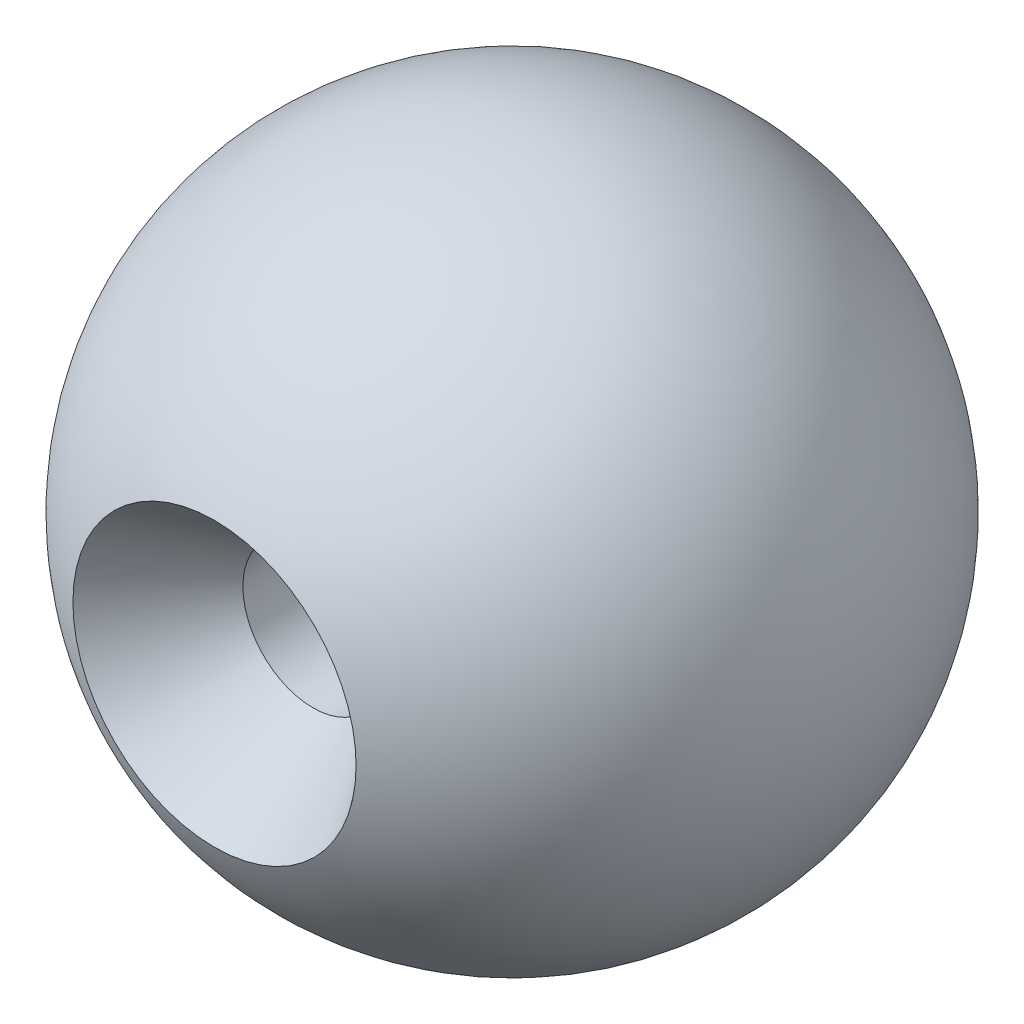
ISO-10303-21;
HEADER;
FILE_DESCRIPTION(('STEP AP214'),'2;1');
FILE_NAME('part.step','',(''),(''),'','','');
FILE_SCHEMA(('AUTOMOTIVE_DESIGN { 1 0 10303 214 1 1 1 1 }'));
ENDSEC;
DATA;
#1=APPLICATION_CONTEXT('core data for automotive mechanical design processes');
#2=APPLICATION_PROTOCOL_DEFINITION('international standard','automotive_design',2000,#1);
#3=PRODUCT_CONTEXT('',#1,'mechanical');
#4=PRODUCT('Part','Part','',(#3));
#5=PRODUCT_RELATED_PRODUCT_CATEGORY('part','',(#4));
#6=PRODUCT_DEFINITION_FORMATION('','',#4);
#7=PRODUCT_DEFINITION_CONTEXT('part definition',#1,'design');
#8=PRODUCT_DEFINITION('design','',#6,#7);
#9=PRODUCT_DEFINITION_SHAPE('','',#8);
#10=(LENGTH_UNIT() NAMED_UNIT(*) SI_UNIT(.MILLI.,.METRE.));
#11=(NAMED_UNIT(*) PLANE_ANGLE_UNIT() SI_UNIT($,.RADIAN.));
#12=(NAMED_UNIT(*) SI_UNIT($,.STERADIAN.) SOLID_ANGLE_UNIT());
#13=UNCERTAINTY_MEASURE_WITH_UNIT(LENGTH_MEASURE(1.E-05),#10,'distance_accuracy_value','');
#14=(GEOMETRIC_REPRESENTATION_CONTEXT(3) GLOBAL_UNCERTAINTY_ASSIGNED_CONTEXT((#13)) GLOBAL_UNIT_ASSIGNED_CONTEXT((#10,
#11,#12)) REPRESENTATION_CONTEXT('',''));
#15=CARTESIAN_POINT('',(0.,0.,0.));
#16=DIRECTION('',(0.,0.,1.));
#17=DIRECTION('',(1.,0.,0.));
#18=AXIS2_PLACEMENT_3D('',#15,#16,#17);
#19=CARTESIAN_POINT('',(0.,0.,0.));
#20=DIRECTION('',(0.,0.,1.));
#21=DIRECTION('',(-1.,0.,0.));
#22=AXIS2_PLACEMENT_3D('',#19,#20,#21);
#23=SPHERICAL_SURFACE('',#22,12.);
#24=CARTESIAN_POINT('',(0.,0.,2.65));
#25=DIRECTION('',(0.,0.,1.));
#26=DIRECTION('',(1.,0.,0.));
#27=AXIS2_PLACEMENT_3D('',#24,#25,#26);
#28=CIRCLE('',#27,11.7037387188881);
#29=CARTESIAN_POINT('',(2.75,-11.3760713781164,2.65));
#30=VERTEX_POINT('',#29);
#31=CARTESIAN_POINT('',(-2.75,-11.3760713781164,2.65));
#32=VERTEX_POINT('',#31);
#33=EDGE_CURVE('E12',#30,#32,#28,.F.);
#34=ORIENTED_EDGE('',*,*,#33,.F.);
#35=CARTESIAN_POINT('',(2.75,0.,0.));
#36=DIRECTION('',(1.,0.,0.));
#37=DIRECTION('',(0.,0.,-1.));
#38=AXIS2_PLACEMENT_3D('',#35,#36,#37);
#39=CIRCLE('',#38,11.6806463862237);
#40=CARTESIAN_POINT('',(2.75,-11.3760713781164,-2.65));
#41=VERTEX_POINT('',#40);
#42=EDGE_CURVE('E130',#41,#30,#39,.F.);
#43=ORIENTED_EDGE('',*,*,#42,.F.);
#44=CARTESIAN_POINT('',(0.,0.,-2.65));
#45=DIRECTION('',(0.,0.,-1.));
#46=DIRECTION('',(-1.,0.,0.));
#47=AXIS2_PLACEMENT_3D('',#44,#45,#46);
#48=CIRCLE('',#47,11.7037387188881);
#49=CARTESIAN_POINT('',(-2.75,-11.3760713781164,-2.65));
#50=VERTEX_POINT('',#49);
#51=EDGE_CURVE('E136',#50,#41,#48,.F.);
#52=ORIENTED_EDGE('',*,*,#51,.F.);
#53=CARTESIAN_POINT('',(-2.75,0.,0.));
#54=DIRECTION('',(-1.,0.,0.));
#55=DIRECTION('',(0.,0.,1.));
#56=AXIS2_PLACEMENT_3D('',#53,#54,#55);
#57=CIRCLE('',#56,11.6806463862237);
#58=EDGE_CURVE('E50',#32,#50,#57,.F.);
#59=ORIENTED_EDGE('',*,*,#58,.F.);
#60=EDGE_LOOP('',(#34,#43,#52,#59));
#61=FACE_BOUND('',#60,.T.);
#62=CARTESIAN_POINT('',(0.,0.,-11.6627344563786));
#63=DIRECTION('',(0.,0.,1.));
#64=DIRECTION('',(1.,0.,0.));
#65=AXIS2_PLACEMENT_3D('',#62,#63,#64);
#66=CIRCLE('',#65,2.825);
#67=CARTESIAN_POINT('',(-2.825,0.,-11.6627344563786));
#68=VERTEX_POINT('',#67);
#69=EDGE_CURVE('E125',#68,#68,#66,.F.);
#70=ORIENTED_EDGE('',*,*,#69,.F.);
#71=EDGE_LOOP('',(#70));
#72=FACE_BOUND('',#71,.T.);
#73=CARTESIAN_POINT('',(0.,0.,10.8364886138746));
#74=DIRECTION('',(0.,0.,-1.));
#75=DIRECTION('',(-1.,0.,0.));
#76=AXIS2_PLACEMENT_3D('',#73,#74,#75);
#77=CIRCLE('',#76,5.1546594961614);
#78=CARTESIAN_POINT('',(-5.1546594961614,0.,10.8364886138746));
#79=VERTEX_POINT('',#78);
#80=EDGE_CURVE('E126',#79,#79,#77,.F.);
#81=ORIENTED_EDGE('',*,*,#80,.F.);
#82=EDGE_LOOP('',(#81));
#83=FACE_BOUND('',#82,.T.);
#84=ADVANCED_FACE('F41',(#61,#72,#83),#23,.T.);
#85=CARTESIAN_POINT('',(0.,0.,12.));
#86=DIRECTION('',(0.,0.,1.));
#87=DIRECTION('',(1.,0.,0.));
#88=AXIS2_PLACEMENT_3D('',#85,#86,#87);
#89=CONICAL_SURFACE('',#88,6.,0.628318530717959);
#90=CARTESIAN_POINT('',(0.,0.,7.25148237437446));
#91=DIRECTION('',(0.,0.,1.));
#92=DIRECTION('',(1.,0.,0.));
#93=AXIS2_PLACEMENT_3D('',#90,#91,#92);
#94=CIRCLE('',#93,2.55);
#95=CARTESIAN_POINT('',(2.55,0.,7.25148237437446));
#96=VERTEX_POINT('',#95);
#97=EDGE_CURVE('E44',#96,#96,#94,.F.);
#98=ORIENTED_EDGE('',*,*,#97,.T.);
#99=EDGE_LOOP('',(#98));
#100=FACE_BOUND('',#99,.T.);
#101=ORIENTED_EDGE('',*,*,#80,.T.);
#102=EDGE_LOOP('',(#101));
#103=FACE_BOUND('',#102,.T.);
#104=ADVANCED_FACE('F158',(#100,#103),#89,.F.);
#105=CARTESIAN_POINT('',(0.,0.,0.999999999999997));
#106=DIRECTION('',(0.,0.,-1.));
#107=DIRECTION('',(-1.,0.,0.));
#108=AXIS2_PLACEMENT_3D('',#105,#106,#107);
#109=CYLINDRICAL_SURFACE('',#108,2.825);
#110=CARTESIAN_POINT('',(0.,0.,0.999999999999997));
#111=DIRECTION('',(0.,0.,-1.));
#112=DIRECTION('',(-1.,0.,0.));
#113=AXIS2_PLACEMENT_3D('',#110,#111,#112);
#114=CIRCLE('',#113,2.825);
#115=CARTESIAN_POINT('',(-2.825,0.,0.999999999999997));
#116=VERTEX_POINT('',#115);
#117=EDGE_CURVE('E121',#116,#116,#114,.T.);
#118=CARTESIAN_POINT('',(-2.825,0.,-11.6627344563786));
#119=CARTESIAN_POINT('',(-2.825,0.,-11.530830972458));
#120=CARTESIAN_POINT('',(-2.825,0.,-11.3989274885374));
#121=CARTESIAN_POINT('',(-2.825,0.,-11.1351205206961));
#122=CARTESIAN_POINT('',(-2.825,0.,-11.0032170367755));
#123=CARTESIAN_POINT('',(-2.825,0.,-10.7394100689343));
#124=CARTESIAN_POINT('',(-2.825,0.,-10.6075065850137));
#125=CARTESIAN_POINT('',(-2.825,0.,-10.3436996171725));
#126=CARTESIAN_POINT('',(-2.825,0.,-10.2117961332519));
#127=CARTESIAN_POINT('',(-2.825,0.,-9.94798916541064));
#128=CARTESIAN_POINT('',(-2.825,0.,-9.81608568149003));
#129=CARTESIAN_POINT('',(-2.825,0.,-9.55227871364881));
#130=CARTESIAN_POINT('',(-2.825,0.,-9.4203752297282));
#131=CARTESIAN_POINT('',(-2.825,0.,-9.15656826188698));
#132=CARTESIAN_POINT('',(-2.825,0.,-9.02466477796637));
#133=CARTESIAN_POINT('',(-2.825,0.,-8.76085781012515));
#134=CARTESIAN_POINT('',(-2.825,0.,-8.62895432620454));
#135=CARTESIAN_POINT('',(-2.825,0.,-8.36514735836332));
#136=CARTESIAN_POINT('',(-2.825,0.,-8.23324387444271));
#137=CARTESIAN_POINT('',(-2.825,0.,-7.96943690660149));
#138=CARTESIAN_POINT('',(-2.825,0.,-7.83753342268088));
#139=CARTESIAN_POINT('',(-2.825,0.,-7.57372645483966));
#140=CARTESIAN_POINT('',(-2.825,0.,-7.44182297091905));
#141=CARTESIAN_POINT('',(-2.825,0.,-7.17801600307783));
#142=CARTESIAN_POINT('',(-2.825,0.,-7.04611251915722));
#143=CARTESIAN_POINT('',(-2.825,0.,-6.782305551316));
#144=CARTESIAN_POINT('',(-2.825,0.,-6.65040206739539));
#145=CARTESIAN_POINT('',(-2.825,0.,-6.38659509955417));
#146=CARTESIAN_POINT('',(-2.825,0.,-6.25469161563356));
#147=CARTESIAN_POINT('',(-2.825,0.,-5.99088464779234));
#148=CARTESIAN_POINT('',(-2.825,0.,-5.85898116387173));
#149=CARTESIAN_POINT('',(-2.825,0.,-5.59517419603051));
#150=CARTESIAN_POINT('',(-2.825,0.,-5.4632707121099));
#151=CARTESIAN_POINT('',(-2.825,0.,-5.19946374426868));
#152=CARTESIAN_POINT('',(-2.825,0.,-5.06756026034807));
#153=CARTESIAN_POINT('',(-2.825,0.,-4.80375329250685));
#154=CARTESIAN_POINT('',(-2.825,0.,-4.67184980858624));
#155=CARTESIAN_POINT('',(-2.825,0.,-4.40804284074502));
#156=CARTESIAN_POINT('',(-2.825,0.,-4.27613935682441));
#157=CARTESIAN_POINT('',(-2.825,0.,-4.01233238898319));
#158=CARTESIAN_POINT('',(-2.825,0.,-3.88042890506258));
#159=CARTESIAN_POINT('',(-2.825,0.,-3.61662193722136));
#160=CARTESIAN_POINT('',(-2.825,0.,-3.48471845330075));
#161=CARTESIAN_POINT('',(-2.825,0.,-3.22091148545953));
#162=CARTESIAN_POINT('',(-2.825,0.,-3.08900800153891));
#163=CARTESIAN_POINT('',(-2.825,0.,-2.8252010336977));
#164=CARTESIAN_POINT('',(-2.825,0.,-2.69329754977709));
#165=CARTESIAN_POINT('',(-2.825,0.,-2.42949058193587));
#166=CARTESIAN_POINT('',(-2.825,0.,-2.29758709801526));
#167=CARTESIAN_POINT('',(-2.825,0.,-2.03378013017403));
#168=CARTESIAN_POINT('',(-2.825,0.,-1.90187664625342));
#169=CARTESIAN_POINT('',(-2.825,0.,-1.6380696784122));
#170=CARTESIAN_POINT('',(-2.825,0.,-1.50616619449159));
#171=CARTESIAN_POINT('',(-2.825,0.,-1.24235922665037));
#172=CARTESIAN_POINT('',(-2.825,0.,-1.11045574272976));
#173=CARTESIAN_POINT('',(-2.825,0.,-0.846648774888544));
#174=CARTESIAN_POINT('',(-2.825,0.,-0.714745290967934));
#175=CARTESIAN_POINT('',(-2.825,0.,-0.450938323126714));
#176=CARTESIAN_POINT('',(-2.825,0.,-0.319034839206104));
#177=CARTESIAN_POINT('',(-2.825,0.,-0.0552278713648837));
#178=CARTESIAN_POINT('',(-2.825,0.,0.0766756125557262));
#179=CARTESIAN_POINT('',(-2.825,0.,0.340482580396947));
#180=CARTESIAN_POINT('',(-2.825,0.,0.472386064317557));
#181=CARTESIAN_POINT('',(-2.825,0.,0.736193032158777));
#182=CARTESIAN_POINT('',(-2.825,0.,0.868096516079387));
#183=CARTESIAN_POINT('',(-2.825,0.,0.999999999999997));
#184=B_SPLINE_CURVE_WITH_KNOTS('',3,(#118,#119,#120,#121,#122,#123,#124,#125,#126,#127,#128,
#129,#130,#131,#132,#133,#134,#135,#136,#137,#138,#139,#140,#141,#142,#143,#144,#145,#146,#147,
#148,#149,#150,#151,#152,#153,#154,#155,#156,#157,#158,#159,#160,#161,#162,#163,#164,#165,#166,
#167,#168,#169,#170,#171,#172,#173,#174,#175,#176,#177,#178,#179,#180,#181,#182,#183),
.UNSPECIFIED.,.F.,.F.,(4,2,2,2,2,2,2,2,2,2,2,2,2,2,2,2,2,2,2,2,2,2,2,2,2,2,2,2,2,2,2,2,4),(0.,
0.39571045176183,0.791420903523661,1.18713135528549,1.58284180704732,1.97855225880915,
2.37426271057098,2.76997316233281,3.16568361409464,3.56139406585647,3.9571045176183,
4.35281496938013,4.74852542114196,5.14423587290379,5.53994632466562,5.93565677642745,
6.33136722818929,6.72707767995112,7.12278813171295,7.51849858347478,7.91420903523661,
8.30991948699844,8.70562993876027,9.1013403905221,9.49705084228393,9.89276129404576,
10.2884717458076,10.6841821975694,11.0798926493313,11.4756031010931,11.8713135528549,
12.2670240046167,12.6627344563786),.UNSPECIFIED.);
#185=EDGE_CURVE('BSEAM162',#68,#116,#184,.T.);
#186=ORIENTED_EDGE('',*,*,#69,.T.);
#187=ORIENTED_EDGE('',*,*,#117,.F.);
#188=ORIENTED_EDGE('',*,*,#185,.T.);
#189=ORIENTED_EDGE('',*,*,#185,.F.);
#190=EDGE_LOOP('',(#186,#188,#187,#189));
#191=FACE_BOUND('',#190,.T.);
#192=ADVANCED_FACE('F162',(#191),#109,.F.);
#193=CARTESIAN_POINT('',(0.,0.,0.999999999999997));
#194=DIRECTION('',(0.,0.,-1.));
#195=DIRECTION('',(-1.,0.,0.));
#196=AXIS2_PLACEMENT_3D('',#193,#194,#195);
#197=PLANE('',#196);
#198=CARTESIAN_POINT('',(0.,0.,0.999999999999997));
#199=DIRECTION('',(0.,0.,-1.));
#200=DIRECTION('',(-1.,0.,0.));
#201=AXIS2_PLACEMENT_3D('',#198,#199,#200);
#202=CIRCLE('',#201,2.55);
#203=CARTESIAN_POINT('',(-2.55,0.,0.999999999999997));
#204=VERTEX_POINT('',#203);
#205=EDGE_CURVE('E106',#204,#204,#202,.T.);
#206=ORIENTED_EDGE('',*,*,#205,.F.);
#207=EDGE_LOOP('',(#206));
#208=FACE_BOUND('',#207,.T.);
#209=ORIENTED_EDGE('',*,*,#117,.T.);
#210=EDGE_LOOP('',(#209));
#211=FACE_BOUND('',#210,.T.);
#212=ADVANCED_FACE('F167',(#208,#211),#197,.T.);
#213=CARTESIAN_POINT('',(0.,-4.,0.));
#214=DIRECTION('',(0.,1.,0.));
#215=DIRECTION('',(0.,0.,1.));
#216=AXIS2_PLACEMENT_3D('',#213,#214,#215);
#217=PLANE('',#216);
#218=DIRECTION('',(0.,0.,1.));
#219=VECTOR('',#218,1.);
#220=CARTESIAN_POINT('',(2.75,-4.,-2.65));
#221=LINE('',#220,#219);
#222=CARTESIAN_POINT('',(2.75,-4.,-2.65));
#223=VERTEX_POINT('',#222);
#224=CARTESIAN_POINT('',(2.75,-4.,2.65));
#225=VERTEX_POINT('',#224);
#226=EDGE_CURVE('E100',#223,#225,#221,.T.);
#227=ORIENTED_EDGE('',*,*,#226,.T.);
#228=DIRECTION('',(-1.,0.,0.));
#229=VECTOR('',#228,1.);
#230=CARTESIAN_POINT('',(-2.75,-4.,2.65));
#231=LINE('',#230,#229);
#232=CARTESIAN_POINT('',(-2.75,-4.,2.65));
#233=VERTEX_POINT('',#232);
#234=EDGE_CURVE('E95',#225,#233,#231,.T.);
#235=ORIENTED_EDGE('',*,*,#234,.T.);
#236=DIRECTION('',(0.,0.,-1.));
#237=VECTOR('',#236,1.);
#238=CARTESIAN_POINT('',(-2.75,-4.,-2.65));
#239=LINE('',#238,#237);
#240=CARTESIAN_POINT('',(-2.75,-4.,-2.65));
#241=VERTEX_POINT('',#240);
#242=EDGE_CURVE('E83',#233,#241,#239,.T.);
#243=ORIENTED_EDGE('',*,*,#242,.T.);
#244=DIRECTION('',(1.,0.,0.));
#245=VECTOR('',#244,1.);
#246=CARTESIAN_POINT('',(-2.75,-4.,-2.65));
#247=LINE('',#246,#245);
#248=EDGE_CURVE('E112',#241,#223,#247,.T.);
#249=ORIENTED_EDGE('',*,*,#248,.T.);
#250=EDGE_LOOP('',(#227,#235,#243,#249));
#251=FACE_BOUND('',#250,.T.);
#252=ADVANCED_FACE('F99',(#251),#217,.F.);
#253=CARTESIAN_POINT('',(-2.75,7.63806258157133,2.65));
#254=DIRECTION('',(0.,0.,1.));
#255=DIRECTION('',(1.,0.,0.));
#256=AXIS2_PLACEMENT_3D('',#253,#254,#255);
#257=PLANE('',#256);
#258=ORIENTED_EDGE('',*,*,#33,.T.);
#259=DIRECTION('',(0.,-1.,0.));
#260=VECTOR('',#259,1.);
#261=CARTESIAN_POINT('',(-2.75,7.63806258157133,2.65));
#262=LINE('',#261,#260);
#263=EDGE_CURVE('E85',#233,#32,#262,.T.);
#264=ORIENTED_EDGE('',*,*,#263,.F.);
#265=ORIENTED_EDGE('',*,*,#234,.F.);
#266=DIRECTION('',(0.,-1.,0.));
#267=VECTOR('',#266,1.);
#268=CARTESIAN_POINT('',(2.75,7.63806258157133,2.65));
#269=LINE('',#268,#267);
#270=EDGE_CURVE('E111',#225,#30,#269,.T.);
#271=ORIENTED_EDGE('',*,*,#270,.T.);
#272=EDGE_LOOP('',(#258,#264,#265,#271));
#273=FACE_BOUND('',#272,.T.);
#274=ADVANCED_FACE('F94',(#273),#257,.F.);
#275=CARTESIAN_POINT('',(-2.75,7.63806258157133,-2.65));
#276=DIRECTION('',(-1.,0.,0.));
#277=DIRECTION('',(0.,0.,1.));
#278=AXIS2_PLACEMENT_3D('',#275,#276,#277);
#279=PLANE('',#278);
#280=ORIENTED_EDGE('',*,*,#58,.T.);
#281=DIRECTION('',(0.,-1.,0.));
#282=VECTOR('',#281,1.);
#283=CARTESIAN_POINT('',(-2.75,7.63806258157133,-2.65));
#284=LINE('',#283,#282);
#285=EDGE_CURVE('E88',#241,#50,#284,.T.);
#286=ORIENTED_EDGE('',*,*,#285,.F.);
#287=ORIENTED_EDGE('',*,*,#242,.F.);
#288=ORIENTED_EDGE('',*,*,#263,.T.);
#289=EDGE_LOOP('',(#280,#286,#287,#288));
#290=FACE_BOUND('',#289,.T.);
#291=ADVANCED_FACE('F84',(#290),#279,.F.);
#292=CARTESIAN_POINT('',(-2.75,7.63806258157133,-2.65));
#293=DIRECTION('',(0.,0.,-1.));
#294=DIRECTION('',(-1.,0.,0.));
#295=AXIS2_PLACEMENT_3D('',#292,#293,#294);
#296=PLANE('',#295);
#297=ORIENTED_EDGE('',*,*,#51,.T.);
#298=DIRECTION('',(0.,-1.,0.));
#299=VECTOR('',#298,1.);
#300=CARTESIAN_POINT('',(2.75,7.63806258157133,-2.65));
#301=LINE('',#300,#299);
#302=EDGE_CURVE('E57',#223,#41,#301,.T.);
#303=ORIENTED_EDGE('',*,*,#302,.F.);
#304=ORIENTED_EDGE('',*,*,#248,.F.);
#305=ORIENTED_EDGE('',*,*,#285,.T.);
#306=EDGE_LOOP('',(#297,#303,#304,#305));
#307=FACE_BOUND('',#306,.T.);
#308=ADVANCED_FACE('F143',(#307),#296,.F.);
#309=CARTESIAN_POINT('',(2.75,7.63806258157133,-2.65));
#310=DIRECTION('',(1.,0.,0.));
#311=DIRECTION('',(0.,0.,-1.));
#312=AXIS2_PLACEMENT_3D('',#309,#310,#311);
#313=PLANE('',#312);
#314=ORIENTED_EDGE('',*,*,#42,.T.);
#315=ORIENTED_EDGE('',*,*,#270,.F.);
#316=ORIENTED_EDGE('',*,*,#226,.F.);
#317=ORIENTED_EDGE('',*,*,#302,.T.);
#318=EDGE_LOOP('',(#314,#315,#316,#317));
#319=FACE_BOUND('',#318,.T.);
#320=ADVANCED_FACE('F146',(#319),#313,.F.);
#321=CARTESIAN_POINT('',(0.,0.,11.));
#322=DIRECTION('',(0.,0.,-1.));
#323=DIRECTION('',(-1.,0.,0.));
#324=AXIS2_PLACEMENT_3D('',#321,#322,#323);
#325=CYLINDRICAL_SURFACE('',#324,2.55);
#326=ORIENTED_EDGE('',*,*,#205,.T.);
#327=EDGE_LOOP('',(#326));
#328=FACE_BOUND('',#327,.T.);
#329=ORIENTED_EDGE('',*,*,#97,.F.);
#330=EDGE_LOOP('',(#329));
#331=FACE_BOUND('',#330,.T.);
#332=ADVANCED_FACE('F148',(#328,#331),#325,.F.);
#333=CLOSED_SHELL('',(#84,#104,#192,#212,#252,#274,#291,#308,#320,#332));
#334=MANIFOLD_SOLID_BREP('B2',#333);
#335=ADVANCED_BREP_SHAPE_REPRESENTATION('',(#18,#334),#14);
#336=SHAPE_DEFINITION_REPRESENTATION(#9,#335);
ENDSEC;
END-ISO-10303-21;
